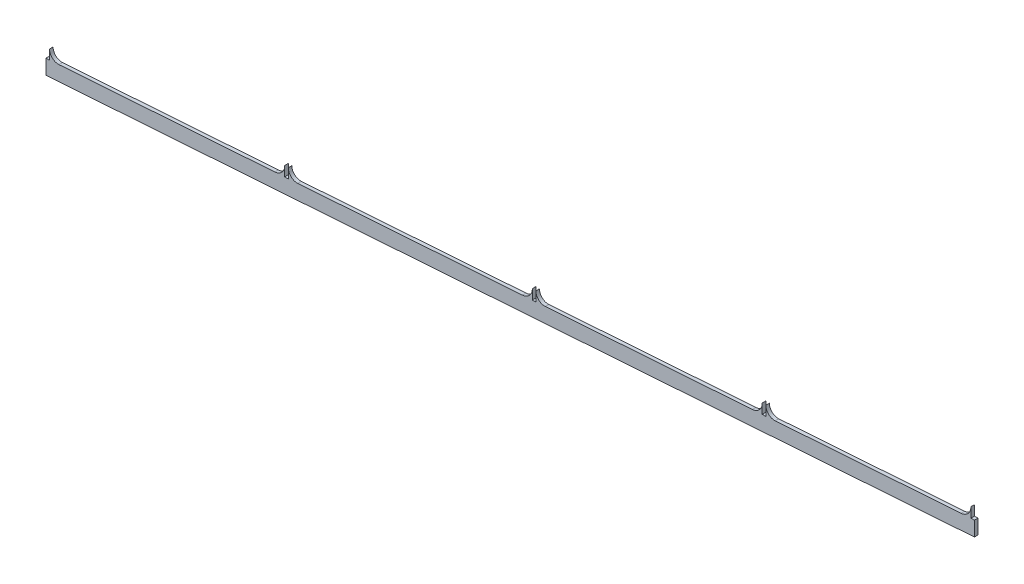
ISO-10303-21;
HEADER;
FILE_DESCRIPTION(('STEP AP214'),'2;1');
FILE_NAME('part.step','',(''),(''),'','','');
FILE_SCHEMA(('AUTOMOTIVE_DESIGN { 1 0 10303 214 1 1 1 1 }'));
ENDSEC;
DATA;
#1=APPLICATION_CONTEXT('core data for automotive mechanical design processes');
#2=APPLICATION_PROTOCOL_DEFINITION('international standard','automotive_design',2000,#1);
#3=PRODUCT_CONTEXT('',#1,'mechanical');
#4=PRODUCT('Part','Part','',(#3));
#5=PRODUCT_RELATED_PRODUCT_CATEGORY('part','',(#4));
#6=PRODUCT_DEFINITION_FORMATION('','',#4);
#7=PRODUCT_DEFINITION_CONTEXT('part definition',#1,'design');
#8=PRODUCT_DEFINITION('design','',#6,#7);
#9=PRODUCT_DEFINITION_SHAPE('','',#8);
#10=(LENGTH_UNIT() NAMED_UNIT(*) SI_UNIT(.MILLI.,.METRE.));
#11=(NAMED_UNIT(*) PLANE_ANGLE_UNIT() SI_UNIT($,.RADIAN.));
#12=(NAMED_UNIT(*) SI_UNIT($,.STERADIAN.) SOLID_ANGLE_UNIT());
#13=UNCERTAINTY_MEASURE_WITH_UNIT(LENGTH_MEASURE(1.E-05),#10,'distance_accuracy_value','');
#14=(GEOMETRIC_REPRESENTATION_CONTEXT(3) GLOBAL_UNCERTAINTY_ASSIGNED_CONTEXT((#13)) GLOBAL_UNIT_ASSIGNED_CONTEXT((#10,
#11,#12)) REPRESENTATION_CONTEXT('',''));
#15=CARTESIAN_POINT('',(0.,0.,0.));
#16=DIRECTION('',(0.,0.,1.));
#17=DIRECTION('',(1.,0.,0.));
#18=AXIS2_PLACEMENT_3D('',#15,#16,#17);
#19=CARTESIAN_POINT('',(132.593665372051,28.8945427780248,2.));
#20=DIRECTION('',(0.,0.,-1.));
#21=DIRECTION('',(-1.,0.,0.));
#22=AXIS2_PLACEMENT_3D('',#19,#20,#21);
#23=CYLINDRICAL_SURFACE('',#22,6.);
#24=CARTESIAN_POINT('',(132.593665372051,28.8945427780248,0.));
#25=DIRECTION('',(0.,0.,1.));
#26=DIRECTION('',(1.,0.,0.));
#27=AXIS2_PLACEMENT_3D('',#24,#25,#26);
#28=CIRCLE('',#27,6.);
#29=CARTESIAN_POINT('',(133.008509302483,22.9089012490504,0.));
#30=VERTEX_POINT('',#29);
#31=CARTESIAN_POINT('',(138.593665372051,28.894542778025,0.));
#32=VERTEX_POINT('',#31);
#33=EDGE_CURVE('E248',#30,#32,#28,.T.);
#34=ORIENTED_EDGE('',*,*,#33,.F.);
#35=DIRECTION('',(0.,0.,-1.));
#36=VECTOR('',#35,1.);
#37=CARTESIAN_POINT('',(133.008509302483,22.9089012490504,2.));
#38=LINE('',#37,#36);
#39=CARTESIAN_POINT('',(133.008509302483,22.9089012490504,2.));
#40=VERTEX_POINT('',#39);
#41=EDGE_CURVE('E11',#40,#30,#38,.T.);
#42=ORIENTED_EDGE('',*,*,#41,.F.);
#43=CARTESIAN_POINT('',(132.593665372051,28.8945427780248,2.));
#44=DIRECTION('',(0.,0.,1.));
#45=DIRECTION('',(1.,0.,0.));
#46=AXIS2_PLACEMENT_3D('',#43,#44,#45);
#47=CIRCLE('',#46,6.);
#48=CARTESIAN_POINT('',(138.593665372051,28.894542778025,2.));
#49=VERTEX_POINT('',#48);
#50=EDGE_CURVE('E317',#40,#49,#47,.T.);
#51=ORIENTED_EDGE('',*,*,#50,.T.);
#52=DIRECTION('',(0.,0.,-1.));
#53=VECTOR('',#52,1.);
#54=CARTESIAN_POINT('',(138.593665372051,28.894542778025,2.));
#55=LINE('',#54,#53);
#56=EDGE_CURVE('E147',#49,#32,#55,.T.);
#57=ORIENTED_EDGE('',*,*,#56,.T.);
#58=EDGE_LOOP('',(#34,#42,#51,#57));
#59=FACE_BOUND('',#58,.T.);
#60=ADVANCED_FACE('F36',(#59),#23,.F.);
#61=CARTESIAN_POINT('',(-0.944308062523726,13.625098839723,2.));
#62=DIRECTION('',(0.0691406550719055,-0.99760692149575,0.));
#63=DIRECTION('',(0.99760692149575,0.0691406550719055,0.));
#64=AXIS2_PLACEMENT_3D('',#61,#62,#63);
#65=PLANE('',#64);
#66=DIRECTION('',(-0.99760692149575,-0.0691406550719055,0.));
#67=VECTOR('',#66,1.);
#68=CARTESIAN_POINT('',(-0.944308062523726,13.625098839723,0.));
#69=LINE('',#68,#67);
#70=CARTESIAN_POINT('',(10.9393686474104,14.4487150102641,0.));
#71=VERTEX_POINT('',#70);
#72=EDGE_CURVE('E251',#30,#71,#69,.T.);
#73=ORIENTED_EDGE('',*,*,#72,.T.);
#74=DIRECTION('',(0.,0.,-1.));
#75=VECTOR('',#74,1.);
#76=CARTESIAN_POINT('',(10.9393686474104,14.4487150102641,2.));
#77=LINE('',#76,#75);
#78=CARTESIAN_POINT('',(10.9393686474104,14.4487150102641,2.));
#79=VERTEX_POINT('',#78);
#80=EDGE_CURVE('E44',#79,#71,#77,.T.);
#81=ORIENTED_EDGE('',*,*,#80,.F.);
#82=DIRECTION('',(-0.99760692149575,-0.0691406550719055,0.));
#83=VECTOR('',#82,1.);
#84=CARTESIAN_POINT('',(-0.944308062523726,13.625098839723,2.));
#85=LINE('',#84,#83);
#86=EDGE_CURVE('E454',#40,#79,#85,.T.);
#87=ORIENTED_EDGE('',*,*,#86,.F.);
#88=ORIENTED_EDGE('',*,*,#41,.T.);
#89=EDGE_LOOP('',(#73,#81,#87,#88));
#90=FACE_BOUND('',#89,.T.);
#91=ADVANCED_FACE('F383',(#90),#65,.F.);
#92=CARTESIAN_POINT('',(10.593665372051,19.4367496177429,2.));
#93=DIRECTION('',(0.,0.,-1.));
#94=DIRECTION('',(-1.,0.,0.));
#95=AXIS2_PLACEMENT_3D('',#92,#93,#94);
#96=CYLINDRICAL_SURFACE('',#95,5.);
#97=CARTESIAN_POINT('',(10.593665372051,19.4367496177429,0.));
#98=DIRECTION('',(0.,0.,1.));
#99=DIRECTION('',(1.,0.,0.));
#100=AXIS2_PLACEMENT_3D('',#97,#98,#99);
#101=CIRCLE('',#100,5.);
#102=CARTESIAN_POINT('',(5.59366537205096,19.4367496177429,0.));
#103=VERTEX_POINT('',#102);
#104=EDGE_CURVE('E254',#103,#71,#101,.T.);
#105=ORIENTED_EDGE('',*,*,#104,.F.);
#106=DIRECTION('',(0.,0.,-1.));
#107=VECTOR('',#106,1.);
#108=CARTESIAN_POINT('',(5.59366537205096,19.4367496177429,2.));
#109=LINE('',#108,#107);
#110=CARTESIAN_POINT('',(5.59366537205096,19.4367496177429,2.));
#111=VERTEX_POINT('',#110);
#112=EDGE_CURVE('E373',#111,#103,#109,.T.);
#113=ORIENTED_EDGE('',*,*,#112,.F.);
#114=CARTESIAN_POINT('',(10.593665372051,19.4367496177429,2.));
#115=DIRECTION('',(0.,0.,1.));
#116=DIRECTION('',(1.,0.,0.));
#117=AXIS2_PLACEMENT_3D('',#114,#115,#116);
#118=CIRCLE('',#117,5.);
#119=EDGE_CURVE('E380',#111,#79,#118,.T.);
#120=ORIENTED_EDGE('',*,*,#119,.T.);
#121=ORIENTED_EDGE('',*,*,#80,.T.);
#122=EDGE_LOOP('',(#105,#113,#120,#121));
#123=FACE_BOUND('',#122,.T.);
#124=ADVANCED_FACE('F378',(#123),#96,.F.);
#125=CARTESIAN_POINT('',(5.59366537205096,0.,2.));
#126=DIRECTION('',(1.,0.,0.));
#127=DIRECTION('',(0.,0.,-1.));
#128=AXIS2_PLACEMENT_3D('',#125,#126,#127);
#129=PLANE('',#128);
#130=DIRECTION('',(0.,-1.,0.));
#131=VECTOR('',#130,1.);
#132=CARTESIAN_POINT('',(5.59366537205096,0.,0.));
#133=LINE('',#132,#131);
#134=CARTESIAN_POINT('',(5.59366537205096,13.9396099454548,0.));
#135=VERTEX_POINT('',#134);
#136=EDGE_CURVE('E257',#103,#135,#133,.T.);
#137=ORIENTED_EDGE('',*,*,#136,.T.);
#138=DIRECTION('',(0.,0.,-1.));
#139=VECTOR('',#138,1.);
#140=CARTESIAN_POINT('',(5.59366537205096,13.9396099454548,2.));
#141=LINE('',#140,#139);
#142=CARTESIAN_POINT('',(5.59366537205096,13.9396099454548,2.));
#143=VERTEX_POINT('',#142);
#144=EDGE_CURVE('E370',#143,#135,#141,.T.);
#145=ORIENTED_EDGE('',*,*,#144,.F.);
#146=DIRECTION('',(0.,-1.,0.));
#147=VECTOR('',#146,1.);
#148=CARTESIAN_POINT('',(5.59366537205096,0.,2.));
#149=LINE('',#148,#147);
#150=EDGE_CURVE('E400',#111,#143,#149,.T.);
#151=ORIENTED_EDGE('',*,*,#150,.F.);
#152=ORIENTED_EDGE('',*,*,#112,.T.);
#153=EDGE_LOOP('',(#137,#145,#151,#152));
#154=FACE_BOUND('',#153,.T.);
#155=ADVANCED_FACE('F391',(#154),#129,.F.);
#156=CARTESIAN_POINT('',(0.,13.9396099454548,2.));
#157=DIRECTION('',(0.,-1.,0.));
#158=DIRECTION('',(0.,0.,-1.));
#159=AXIS2_PLACEMENT_3D('',#156,#157,#158);
#160=PLANE('',#159);
#161=DIRECTION('',(-1.,0.,0.));
#162=VECTOR('',#161,1.);
#163=CARTESIAN_POINT('',(0.,13.9396099454548,0.));
#164=LINE('',#163,#162);
#165=CARTESIAN_POINT('',(3.59366537205096,13.9396099454548,0.));
#166=VERTEX_POINT('',#165);
#167=EDGE_CURVE('E259',#135,#166,#164,.T.);
#168=ORIENTED_EDGE('',*,*,#167,.T.);
#169=DIRECTION('',(0.,0.,-1.));
#170=VECTOR('',#169,1.);
#171=CARTESIAN_POINT('',(3.59366537205096,13.9396099454548,2.));
#172=LINE('',#171,#170);
#173=CARTESIAN_POINT('',(3.59366537205096,13.9396099454548,2.));
#174=VERTEX_POINT('',#173);
#175=EDGE_CURVE('E367',#174,#166,#172,.T.);
#176=ORIENTED_EDGE('',*,*,#175,.F.);
#177=DIRECTION('',(-1.,0.,0.));
#178=VECTOR('',#177,1.);
#179=CARTESIAN_POINT('',(0.,13.9396099454548,2.));
#180=LINE('',#179,#178);
#181=EDGE_CURVE('E397',#143,#174,#180,.T.);
#182=ORIENTED_EDGE('',*,*,#181,.F.);
#183=ORIENTED_EDGE('',*,*,#144,.T.);
#184=EDGE_LOOP('',(#168,#176,#182,#183));
#185=FACE_BOUND('',#184,.T.);
#186=ADVANCED_FACE('F395',(#185),#160,.F.);
#187=CARTESIAN_POINT('',(3.59366537205096,0.,2.));
#188=DIRECTION('',(1.,0.,0.));
#189=DIRECTION('',(0.,0.,-1.));
#190=AXIS2_PLACEMENT_3D('',#187,#188,#189);
#191=PLANE('',#190);
#192=DIRECTION('',(0.,-1.,0.));
#193=VECTOR('',#192,1.);
#194=CARTESIAN_POINT('',(3.59366537205096,0.,0.));
#195=LINE('',#194,#193);
#196=CARTESIAN_POINT('',(3.59366537205096,5.53960994545469,0.));
#197=VERTEX_POINT('',#196);
#198=EDGE_CURVE('E261',#166,#197,#195,.T.);
#199=ORIENTED_EDGE('',*,*,#198,.T.);
#200=DIRECTION('',(0.,0.,-1.));
#201=VECTOR('',#200,1.);
#202=CARTESIAN_POINT('',(3.59366537205096,5.53960994545469,2.));
#203=LINE('',#202,#201);
#204=CARTESIAN_POINT('',(3.59366537205096,5.53960994545469,2.));
#205=VERTEX_POINT('',#204);
#206=EDGE_CURVE('E364',#205,#197,#203,.T.);
#207=ORIENTED_EDGE('',*,*,#206,.F.);
#208=DIRECTION('',(0.,-1.,0.));
#209=VECTOR('',#208,1.);
#210=CARTESIAN_POINT('',(3.59366537205096,0.,2.));
#211=LINE('',#210,#209);
#212=EDGE_CURVE('E399',#174,#205,#211,.T.);
#213=ORIENTED_EDGE('',*,*,#212,.F.);
#214=ORIENTED_EDGE('',*,*,#175,.T.);
#215=EDGE_LOOP('',(#199,#207,#213,#214));
#216=FACE_BOUND('',#215,.T.);
#217=ADVANCED_FACE('F470',(#216),#191,.F.);
#218=CARTESIAN_POINT('',(-0.364916415649253,5.2652544532665,2.));
#219=DIRECTION('',(-0.0691406550719058,0.99760692149575,0.));
#220=DIRECTION('',(-0.99760692149575,-0.0691406550719058,0.));
#221=AXIS2_PLACEMENT_3D('',#218,#219,#220);
#222=PLANE('',#221);
#223=DIRECTION('',(0.99760692149575,0.0691406550719058,0.));
#224=VECTOR('',#223,1.);
#225=CARTESIAN_POINT('',(-0.364916415649253,5.2652544532665,0.));
#226=LINE('',#225,#224);
#227=CARTESIAN_POINT('',(528.59366537205,41.9255282170784,0.));
#228=VERTEX_POINT('',#227);
#229=EDGE_CURVE('E263',#197,#228,#226,.T.);
#230=ORIENTED_EDGE('',*,*,#229,.T.);
#231=DIRECTION('',(0.,0.,-1.));
#232=VECTOR('',#231,1.);
#233=CARTESIAN_POINT('',(528.59366537205,41.9255282170784,2.));
#234=LINE('',#233,#232);
#235=CARTESIAN_POINT('',(528.59366537205,41.9255282170784,2.));
#236=VERTEX_POINT('',#235);
#237=EDGE_CURVE('E361',#236,#228,#234,.T.);
#238=ORIENTED_EDGE('',*,*,#237,.F.);
#239=DIRECTION('',(0.99760692149575,0.0691406550719058,0.));
#240=VECTOR('',#239,1.);
#241=CARTESIAN_POINT('',(-0.364916415649253,5.2652544532665,2.));
#242=LINE('',#241,#240);
#243=EDGE_CURVE('E402',#205,#236,#242,.T.);
#244=ORIENTED_EDGE('',*,*,#243,.F.);
#245=ORIENTED_EDGE('',*,*,#206,.T.);
#246=EDGE_LOOP('',(#230,#238,#244,#245));
#247=FACE_BOUND('',#246,.T.);
#248=ADVANCED_FACE('F473',(#247),#222,.F.);
#249=CARTESIAN_POINT('',(528.59366537205,0.,2.));
#250=DIRECTION('',(-1.,0.,0.));
#251=DIRECTION('',(0.,0.,1.));
#252=AXIS2_PLACEMENT_3D('',#249,#250,#251);
#253=PLANE('',#252);
#254=DIRECTION('',(0.,1.,0.));
#255=VECTOR('',#254,1.);
#256=CARTESIAN_POINT('',(528.59366537205,0.,0.));
#257=LINE('',#256,#255);
#258=CARTESIAN_POINT('',(528.59366537205,50.1869151950914,0.));
#259=VERTEX_POINT('',#258);
#260=EDGE_CURVE('E265',#228,#259,#257,.T.);
#261=ORIENTED_EDGE('',*,*,#260,.T.);
#262=DIRECTION('',(0.,0.,-1.));
#263=VECTOR('',#262,1.);
#264=CARTESIAN_POINT('',(528.59366537205,50.1869151950914,2.));
#265=LINE('',#264,#263);
#266=CARTESIAN_POINT('',(528.59366537205,50.1869151950914,2.));
#267=VERTEX_POINT('',#266);
#268=EDGE_CURVE('E358',#267,#259,#265,.T.);
#269=ORIENTED_EDGE('',*,*,#268,.F.);
#270=DIRECTION('',(0.,1.,0.));
#271=VECTOR('',#270,1.);
#272=CARTESIAN_POINT('',(528.59366537205,0.,2.));
#273=LINE('',#272,#271);
#274=EDGE_CURVE('E408',#236,#267,#273,.T.);
#275=ORIENTED_EDGE('',*,*,#274,.F.);
#276=ORIENTED_EDGE('',*,*,#237,.T.);
#277=EDGE_LOOP('',(#261,#269,#275,#276));
#278=FACE_BOUND('',#277,.T.);
#279=ADVANCED_FACE('F477',(#278),#253,.F.);
#280=CARTESIAN_POINT('',(0.,50.1869151950914,2.));
#281=DIRECTION('',(0.,-1.,0.));
#282=DIRECTION('',(0.,0.,-1.));
#283=AXIS2_PLACEMENT_3D('',#280,#281,#282);
#284=PLANE('',#283);
#285=DIRECTION('',(-1.,0.,0.));
#286=VECTOR('',#285,1.);
#287=CARTESIAN_POINT('',(0.,50.1869151950914,0.));
#288=LINE('',#287,#286);
#289=CARTESIAN_POINT('',(526.59366537205,50.1869151950914,0.));
#290=VERTEX_POINT('',#289);
#291=EDGE_CURVE('E267',#259,#290,#288,.T.);
#292=ORIENTED_EDGE('',*,*,#291,.T.);
#293=DIRECTION('',(0.,0.,-1.));
#294=VECTOR('',#293,1.);
#295=CARTESIAN_POINT('',(526.59366537205,50.1869151950914,2.));
#296=LINE('',#295,#294);
#297=CARTESIAN_POINT('',(526.59366537205,50.1869151950914,2.));
#298=VERTEX_POINT('',#297);
#299=EDGE_CURVE('E355',#298,#290,#296,.T.);
#300=ORIENTED_EDGE('',*,*,#299,.F.);
#301=DIRECTION('',(-1.,0.,0.));
#302=VECTOR('',#301,1.);
#303=CARTESIAN_POINT('',(0.,50.1869151950914,2.));
#304=LINE('',#303,#302);
#305=EDGE_CURVE('E410',#267,#298,#304,.T.);
#306=ORIENTED_EDGE('',*,*,#305,.F.);
#307=ORIENTED_EDGE('',*,*,#268,.T.);
#308=EDGE_LOOP('',(#292,#300,#306,#307));
#309=FACE_BOUND('',#308,.T.);
#310=ADVANCED_FACE('F481',(#309),#284,.F.);
#311=CARTESIAN_POINT('',(526.59366537205,0.,2.));
#312=DIRECTION('',(-1.,0.,0.));
#313=DIRECTION('',(0.,0.,1.));
#314=AXIS2_PLACEMENT_3D('',#311,#312,#313);
#315=PLANE('',#314);
#316=DIRECTION('',(0.,1.,0.));
#317=VECTOR('',#316,1.);
#318=CARTESIAN_POINT('',(526.59366537205,0.,0.));
#319=LINE('',#318,#317);
#320=CARTESIAN_POINT('',(526.59366537205,55.7854690435297,0.));
#321=VERTEX_POINT('',#320);
#322=EDGE_CURVE('E269',#290,#321,#319,.T.);
#323=ORIENTED_EDGE('',*,*,#322,.T.);
#324=DIRECTION('',(0.,0.,-1.));
#325=VECTOR('',#324,1.);
#326=CARTESIAN_POINT('',(526.59366537205,55.7854690435297,2.));
#327=LINE('',#326,#325);
#328=CARTESIAN_POINT('',(526.59366537205,55.7854690435297,2.));
#329=VERTEX_POINT('',#328);
#330=EDGE_CURVE('E353',#329,#321,#327,.T.);
#331=ORIENTED_EDGE('',*,*,#330,.F.);
#332=DIRECTION('',(0.,1.,0.));
#333=VECTOR('',#332,1.);
#334=CARTESIAN_POINT('',(526.59366537205,0.,2.));
#335=LINE('',#334,#333);
#336=EDGE_CURVE('E412',#298,#329,#335,.T.);
#337=ORIENTED_EDGE('',*,*,#336,.F.);
#338=ORIENTED_EDGE('',*,*,#299,.T.);
#339=EDGE_LOOP('',(#323,#331,#337,#338));
#340=FACE_BOUND('',#339,.T.);
#341=ADVANCED_FACE('F485',(#340),#315,.F.);
#342=CARTESIAN_POINT('',(520.59366537205,55.7854690435296,2.));
#343=DIRECTION('',(0.,0.,-1.));
#344=DIRECTION('',(-1.,0.,0.));
#345=AXIS2_PLACEMENT_3D('',#342,#343,#344);
#346=CYLINDRICAL_SURFACE('',#345,6.);
#347=CARTESIAN_POINT('',(520.59366537205,55.7854690435296,0.));
#348=DIRECTION('',(0.,0.,1.));
#349=DIRECTION('',(1.,0.,0.));
#350=AXIS2_PLACEMENT_3D('',#347,#348,#349);
#351=CIRCLE('',#350,6.);
#352=CARTESIAN_POINT('',(521.008509302482,49.7998275145551,0.));
#353=VERTEX_POINT('',#352);
#354=EDGE_CURVE('E272',#353,#321,#351,.T.);
#355=ORIENTED_EDGE('',*,*,#354,.F.);
#356=DIRECTION('',(0.,0.,-1.));
#357=VECTOR('',#356,1.);
#358=CARTESIAN_POINT('',(521.008509302482,49.7998275145551,2.));
#359=LINE('',#358,#357);
#360=CARTESIAN_POINT('',(521.008509302482,49.7998275145551,2.));
#361=VERTEX_POINT('',#360);
#362=EDGE_CURVE('E351',#361,#353,#359,.T.);
#363=ORIENTED_EDGE('',*,*,#362,.F.);
#364=CARTESIAN_POINT('',(520.59366537205,55.7854690435296,2.));
#365=DIRECTION('',(0.,0.,1.));
#366=DIRECTION('',(1.,0.,0.));
#367=AXIS2_PLACEMENT_3D('',#364,#365,#366);
#368=CIRCLE('',#367,6.);
#369=EDGE_CURVE('E414',#361,#329,#368,.T.);
#370=ORIENTED_EDGE('',*,*,#369,.T.);
#371=ORIENTED_EDGE('',*,*,#330,.T.);
#372=EDGE_LOOP('',(#355,#363,#370,#371));
#373=FACE_BOUND('',#372,.T.);
#374=ADVANCED_FACE('F489',(#373),#346,.F.);
#375=CARTESIAN_POINT('',(-0.944308062523782,13.6250988397243,2.));
#376=DIRECTION('',(0.0691406550719033,-0.99760692149575,0.));
#377=DIRECTION('',(0.99760692149575,0.0691406550719033,0.));
#378=AXIS2_PLACEMENT_3D('',#375,#376,#377);
#379=PLANE('',#378);
#380=DIRECTION('',(-0.99760692149575,-0.0691406550719033,0.));
#381=VECTOR('',#380,1.);
#382=CARTESIAN_POINT('',(-0.944308062523782,13.6250988397243,0.));
#383=LINE('',#382,#381);
#384=CARTESIAN_POINT('',(415.93936864741,42.5178519626597,0.));
#385=VERTEX_POINT('',#384);
#386=EDGE_CURVE('E275',#353,#385,#383,.T.);
#387=ORIENTED_EDGE('',*,*,#386,.T.);
#388=DIRECTION('',(0.,0.,-1.));
#389=VECTOR('',#388,1.);
#390=CARTESIAN_POINT('',(415.93936864741,42.5178519626597,2.));
#391=LINE('',#390,#389);
#392=CARTESIAN_POINT('',(415.93936864741,42.5178519626597,2.));
#393=VERTEX_POINT('',#392);
#394=EDGE_CURVE('E349',#393,#385,#391,.T.);
#395=ORIENTED_EDGE('',*,*,#394,.F.);
#396=DIRECTION('',(-0.99760692149575,-0.0691406550719033,0.));
#397=VECTOR('',#396,1.);
#398=CARTESIAN_POINT('',(-0.944308062523782,13.6250988397243,2.));
#399=LINE('',#398,#397);
#400=EDGE_CURVE('E417',#361,#393,#399,.T.);
#401=ORIENTED_EDGE('',*,*,#400,.F.);
#402=ORIENTED_EDGE('',*,*,#362,.T.);
#403=EDGE_LOOP('',(#387,#395,#401,#402));
#404=FACE_BOUND('',#403,.T.);
#405=ADVANCED_FACE('F493',(#404),#379,.F.);
#406=CARTESIAN_POINT('',(415.59366537205,47.5058865701385,2.));
#407=DIRECTION('',(0.,0.,-1.));
#408=DIRECTION('',(-1.,0.,0.));
#409=AXIS2_PLACEMENT_3D('',#406,#407,#408);
#410=CYLINDRICAL_SURFACE('',#409,5.);
#411=CARTESIAN_POINT('',(415.59366537205,47.5058865701385,0.));
#412=DIRECTION('',(0.,0.,1.));
#413=DIRECTION('',(1.,0.,0.));
#414=AXIS2_PLACEMENT_3D('',#411,#412,#413);
#415=CIRCLE('',#414,5.);
#416=CARTESIAN_POINT('',(410.59366537205,47.5058865701385,0.));
#417=VERTEX_POINT('',#416);
#418=EDGE_CURVE('E278',#417,#385,#415,.T.);
#419=ORIENTED_EDGE('',*,*,#418,.F.);
#420=DIRECTION('',(0.,0.,-1.));
#421=VECTOR('',#420,1.);
#422=CARTESIAN_POINT('',(410.59366537205,47.5058865701385,2.));
#423=LINE('',#422,#421);
#424=CARTESIAN_POINT('',(410.59366537205,47.5058865701385,2.));
#425=VERTEX_POINT('',#424);
#426=EDGE_CURVE('E347',#425,#417,#423,.T.);
#427=ORIENTED_EDGE('',*,*,#426,.F.);
#428=CARTESIAN_POINT('',(415.59366537205,47.5058865701385,2.));
#429=DIRECTION('',(0.,0.,1.));
#430=DIRECTION('',(1.,0.,0.));
#431=AXIS2_PLACEMENT_3D('',#428,#429,#430);
#432=CIRCLE('',#431,5.);
#433=EDGE_CURVE('E419',#425,#393,#432,.T.);
#434=ORIENTED_EDGE('',*,*,#433,.T.);
#435=ORIENTED_EDGE('',*,*,#394,.T.);
#436=EDGE_LOOP('',(#419,#427,#434,#435));
#437=FACE_BOUND('',#436,.T.);
#438=ADVANCED_FACE('F497',(#437),#410,.F.);
#439=CARTESIAN_POINT('',(410.59366537205,0.,2.));
#440=DIRECTION('',(1.,0.,0.));
#441=DIRECTION('',(0.,0.,-1.));
#442=AXIS2_PLACEMENT_3D('',#439,#440,#441);
#443=PLANE('',#442);
#444=DIRECTION('',(0.,-1.,0.));
#445=VECTOR('',#444,1.);
#446=CARTESIAN_POINT('',(410.59366537205,0.,0.));
#447=LINE('',#446,#445);
#448=CARTESIAN_POINT('',(410.59366537205,42.0087468978504,0.));
#449=VERTEX_POINT('',#448);
#450=EDGE_CURVE('E281',#417,#449,#447,.T.);
#451=ORIENTED_EDGE('',*,*,#450,.T.);
#452=DIRECTION('',(0.,0.,-1.));
#453=VECTOR('',#452,1.);
#454=CARTESIAN_POINT('',(410.59366537205,42.0087468978504,2.));
#455=LINE('',#454,#453);
#456=CARTESIAN_POINT('',(410.59366537205,42.0087468978504,2.));
#457=VERTEX_POINT('',#456);
#458=EDGE_CURVE('E344',#457,#449,#455,.T.);
#459=ORIENTED_EDGE('',*,*,#458,.F.);
#460=DIRECTION('',(0.,-1.,0.));
#461=VECTOR('',#460,1.);
#462=CARTESIAN_POINT('',(410.59366537205,0.,2.));
#463=LINE('',#462,#461);
#464=EDGE_CURVE('E422',#425,#457,#463,.T.);
#465=ORIENTED_EDGE('',*,*,#464,.F.);
#466=ORIENTED_EDGE('',*,*,#426,.T.);
#467=EDGE_LOOP('',(#451,#459,#465,#466));
#468=FACE_BOUND('',#467,.T.);
#469=ADVANCED_FACE('F501',(#468),#443,.F.);
#470=CARTESIAN_POINT('',(0.,42.0087468978504,2.));
#471=DIRECTION('',(0.,-1.,0.));
#472=DIRECTION('',(0.,0.,-1.));
#473=AXIS2_PLACEMENT_3D('',#470,#471,#472);
#474=PLANE('',#473);
#475=DIRECTION('',(-1.,0.,0.));
#476=VECTOR('',#475,1.);
#477=CARTESIAN_POINT('',(0.,42.0087468978504,0.));
#478=LINE('',#477,#476);
#479=CARTESIAN_POINT('',(408.59366537205,42.0087468978504,0.));
#480=VERTEX_POINT('',#479);
#481=EDGE_CURVE('E283',#449,#480,#478,.T.);
#482=ORIENTED_EDGE('',*,*,#481,.T.);
#483=DIRECTION('',(0.,0.,-1.));
#484=VECTOR('',#483,1.);
#485=CARTESIAN_POINT('',(408.59366537205,42.0087468978504,2.));
#486=LINE('',#485,#484);
#487=CARTESIAN_POINT('',(408.59366537205,42.0087468978504,2.));
#488=VERTEX_POINT('',#487);
#489=EDGE_CURVE('E341',#488,#480,#486,.T.);
#490=ORIENTED_EDGE('',*,*,#489,.F.);
#491=DIRECTION('',(-1.,0.,0.));
#492=VECTOR('',#491,1.);
#493=CARTESIAN_POINT('',(0.,42.0087468978504,2.));
#494=LINE('',#493,#492);
#495=EDGE_CURVE('E424',#457,#488,#494,.T.);
#496=ORIENTED_EDGE('',*,*,#495,.F.);
#497=ORIENTED_EDGE('',*,*,#458,.T.);
#498=EDGE_LOOP('',(#482,#490,#496,#497));
#499=FACE_BOUND('',#498,.T.);
#500=ADVANCED_FACE('F505',(#499),#474,.F.);
#501=CARTESIAN_POINT('',(408.59366537205,0.,2.));
#502=DIRECTION('',(-1.,0.,0.));
#503=DIRECTION('',(0.,0.,1.));
#504=AXIS2_PLACEMENT_3D('',#501,#502,#503);
#505=PLANE('',#504);
#506=DIRECTION('',(0.,1.,0.));
#507=VECTOR('',#506,1.);
#508=CARTESIAN_POINT('',(408.59366537205,0.,0.));
#509=LINE('',#508,#507);
#510=CARTESIAN_POINT('',(408.59366537205,47.6073007462915,0.));
#511=VERTEX_POINT('',#510);
#512=EDGE_CURVE('E285',#480,#511,#509,.T.);
#513=ORIENTED_EDGE('',*,*,#512,.T.);
#514=DIRECTION('',(0.,0.,-1.));
#515=VECTOR('',#514,1.);
#516=CARTESIAN_POINT('',(408.59366537205,47.6073007462915,2.));
#517=LINE('',#516,#515);
#518=CARTESIAN_POINT('',(408.59366537205,47.6073007462915,2.));
#519=VERTEX_POINT('',#518);
#520=EDGE_CURVE('E339',#519,#511,#517,.T.);
#521=ORIENTED_EDGE('',*,*,#520,.F.);
#522=DIRECTION('',(0.,1.,0.));
#523=VECTOR('',#522,1.);
#524=CARTESIAN_POINT('',(408.59366537205,0.,2.));
#525=LINE('',#524,#523);
#526=EDGE_CURVE('E426',#488,#519,#525,.T.);
#527=ORIENTED_EDGE('',*,*,#526,.F.);
#528=ORIENTED_EDGE('',*,*,#489,.T.);
#529=EDGE_LOOP('',(#513,#521,#527,#528));
#530=FACE_BOUND('',#529,.T.);
#531=ADVANCED_FACE('F509',(#530),#505,.F.);
#532=CARTESIAN_POINT('',(402.59366537205,47.6073007462881,2.));
#533=DIRECTION('',(0.,0.,-1.));
#534=DIRECTION('',(-1.,0.,0.));
#535=AXIS2_PLACEMENT_3D('',#532,#533,#534);
#536=CYLINDRICAL_SURFACE('',#535,6.00000000000001);
#537=CARTESIAN_POINT('',(402.59366537205,47.6073007462881,0.));
#538=DIRECTION('',(0.,0.,1.));
#539=DIRECTION('',(1.,0.,0.));
#540=AXIS2_PLACEMENT_3D('',#537,#538,#539);
#541=CIRCLE('',#540,6.00000000000001);
#542=CARTESIAN_POINT('',(403.008509302482,41.6216592173137,0.));
#543=VERTEX_POINT('',#542);
#544=EDGE_CURVE('E288',#543,#511,#541,.T.);
#545=ORIENTED_EDGE('',*,*,#544,.F.);
#546=DIRECTION('',(0.,0.,-1.));
#547=VECTOR('',#546,1.);
#548=CARTESIAN_POINT('',(403.008509302482,41.6216592173137,2.));
#549=LINE('',#548,#547);
#550=CARTESIAN_POINT('',(403.008509302482,41.6216592173137,2.));
#551=VERTEX_POINT('',#550);
#552=EDGE_CURVE('E337',#551,#543,#549,.T.);
#553=ORIENTED_EDGE('',*,*,#552,.F.);
#554=CARTESIAN_POINT('',(402.59366537205,47.6073007462881,2.));
#555=DIRECTION('',(0.,0.,1.));
#556=DIRECTION('',(1.,0.,0.));
#557=AXIS2_PLACEMENT_3D('',#554,#555,#556);
#558=CIRCLE('',#557,6.00000000000001);
#559=EDGE_CURVE('E428',#551,#519,#558,.T.);
#560=ORIENTED_EDGE('',*,*,#559,.T.);
#561=ORIENTED_EDGE('',*,*,#520,.T.);
#562=EDGE_LOOP('',(#545,#553,#560,#561));
#563=FACE_BOUND('',#562,.T.);
#564=ADVANCED_FACE('F513',(#563),#536,.F.);
#565=CARTESIAN_POINT('',(-0.944308062523752,13.625098839724,2.));
#566=DIRECTION('',(0.0691406550719027,-0.99760692149575,0.));
#567=DIRECTION('',(0.99760692149575,0.0691406550719027,0.));
#568=AXIS2_PLACEMENT_3D('',#565,#566,#567);
#569=PLANE('',#568);
#570=DIRECTION('',(-0.99760692149575,-0.0691406550719027,0.));
#571=VECTOR('',#570,1.);
#572=CARTESIAN_POINT('',(-0.944308062523752,13.625098839724,0.));
#573=LINE('',#572,#571);
#574=CARTESIAN_POINT('',(285.93936864741,33.5080055334956,0.));
#575=VERTEX_POINT('',#574);
#576=EDGE_CURVE('E291',#543,#575,#573,.T.);
#577=ORIENTED_EDGE('',*,*,#576,.T.);
#578=DIRECTION('',(0.,0.,-1.));
#579=VECTOR('',#578,1.);
#580=CARTESIAN_POINT('',(285.93936864741,33.5080055334956,2.));
#581=LINE('',#580,#579);
#582=CARTESIAN_POINT('',(285.93936864741,33.5080055334956,2.));
#583=VERTEX_POINT('',#582);
#584=EDGE_CURVE('E335',#583,#575,#581,.T.);
#585=ORIENTED_EDGE('',*,*,#584,.F.);
#586=DIRECTION('',(-0.99760692149575,-0.0691406550719027,0.));
#587=VECTOR('',#586,1.);
#588=CARTESIAN_POINT('',(-0.944308062523752,13.625098839724,2.));
#589=LINE('',#588,#587);
#590=EDGE_CURVE('E431',#551,#583,#589,.T.);
#591=ORIENTED_EDGE('',*,*,#590,.F.);
#592=ORIENTED_EDGE('',*,*,#552,.T.);
#593=EDGE_LOOP('',(#577,#585,#591,#592));
#594=FACE_BOUND('',#593,.T.);
#595=ADVANCED_FACE('F517',(#594),#569,.F.);
#596=CARTESIAN_POINT('',(285.593665372051,38.4960401409744,2.));
#597=DIRECTION('',(0.,0.,-1.));
#598=DIRECTION('',(-1.,0.,0.));
#599=AXIS2_PLACEMENT_3D('',#596,#597,#598);
#600=CYLINDRICAL_SURFACE('',#599,4.99999999999997);
#601=CARTESIAN_POINT('',(285.593665372051,38.4960401409744,0.));
#602=DIRECTION('',(0.,0.,1.));
#603=DIRECTION('',(1.,0.,0.));
#604=AXIS2_PLACEMENT_3D('',#601,#602,#603);
#605=CIRCLE('',#604,4.99999999999997);
#606=CARTESIAN_POINT('',(280.593665372051,38.4960401409744,0.));
#607=VERTEX_POINT('',#606);
#608=EDGE_CURVE('E294',#607,#575,#605,.T.);
#609=ORIENTED_EDGE('',*,*,#608,.F.);
#610=DIRECTION('',(0.,0.,-1.));
#611=VECTOR('',#610,1.);
#612=CARTESIAN_POINT('',(280.593665372051,38.4960401409744,2.));
#613=LINE('',#612,#611);
#614=CARTESIAN_POINT('',(280.593665372051,38.4960401409744,2.));
#615=VERTEX_POINT('',#614);
#616=EDGE_CURVE('E333',#615,#607,#613,.T.);
#617=ORIENTED_EDGE('',*,*,#616,.F.);
#618=CARTESIAN_POINT('',(285.593665372051,38.4960401409744,2.));
#619=DIRECTION('',(0.,0.,1.));
#620=DIRECTION('',(1.,0.,0.));
#621=AXIS2_PLACEMENT_3D('',#618,#619,#620);
#622=CIRCLE('',#621,4.99999999999997);
#623=EDGE_CURVE('E433',#615,#583,#622,.T.);
#624=ORIENTED_EDGE('',*,*,#623,.T.);
#625=ORIENTED_EDGE('',*,*,#584,.T.);
#626=EDGE_LOOP('',(#609,#617,#624,#625));
#627=FACE_BOUND('',#626,.T.);
#628=ADVANCED_FACE('F521',(#627),#600,.F.);
#629=CARTESIAN_POINT('',(280.593665372051,0.,2.));
#630=DIRECTION('',(1.,0.,0.));
#631=DIRECTION('',(0.,0.,-1.));
#632=AXIS2_PLACEMENT_3D('',#629,#630,#631);
#633=PLANE('',#632);
#634=DIRECTION('',(0.,-1.,0.));
#635=VECTOR('',#634,1.);
#636=CARTESIAN_POINT('',(280.593665372051,0.,0.));
#637=LINE('',#636,#635);
#638=CARTESIAN_POINT('',(280.593665372051,32.9989004686863,0.));
#639=VERTEX_POINT('',#638);
#640=EDGE_CURVE('E297',#607,#639,#637,.T.);
#641=ORIENTED_EDGE('',*,*,#640,.T.);
#642=DIRECTION('',(0.,0.,-1.));
#643=VECTOR('',#642,1.);
#644=CARTESIAN_POINT('',(280.593665372051,32.9989004686863,2.));
#645=LINE('',#644,#643);
#646=CARTESIAN_POINT('',(280.593665372051,32.9989004686863,2.));
#647=VERTEX_POINT('',#646);
#648=EDGE_CURVE('E330',#647,#639,#645,.T.);
#649=ORIENTED_EDGE('',*,*,#648,.F.);
#650=DIRECTION('',(0.,-1.,0.));
#651=VECTOR('',#650,1.);
#652=CARTESIAN_POINT('',(280.593665372051,0.,2.));
#653=LINE('',#652,#651);
#654=EDGE_CURVE('E436',#615,#647,#653,.T.);
#655=ORIENTED_EDGE('',*,*,#654,.F.);
#656=ORIENTED_EDGE('',*,*,#616,.T.);
#657=EDGE_LOOP('',(#641,#649,#655,#656));
#658=FACE_BOUND('',#657,.T.);
#659=ADVANCED_FACE('F525',(#658),#633,.F.);
#660=CARTESIAN_POINT('',(0.,32.9989004686863,2.));
#661=DIRECTION('',(0.,-1.,0.));
#662=DIRECTION('',(0.,0.,-1.));
#663=AXIS2_PLACEMENT_3D('',#660,#661,#662);
#664=PLANE('',#663);
#665=DIRECTION('',(-1.,0.,0.));
#666=VECTOR('',#665,1.);
#667=CARTESIAN_POINT('',(0.,32.9989004686863,0.));
#668=LINE('',#667,#666);
#669=CARTESIAN_POINT('',(278.593665372051,32.9989004686863,0.));
#670=VERTEX_POINT('',#669);
#671=EDGE_CURVE('E299',#639,#670,#668,.T.);
#672=ORIENTED_EDGE('',*,*,#671,.T.);
#673=DIRECTION('',(0.,0.,-1.));
#674=VECTOR('',#673,1.);
#675=CARTESIAN_POINT('',(278.593665372051,32.9989004686863,2.));
#676=LINE('',#675,#674);
#677=CARTESIAN_POINT('',(278.593665372051,32.9989004686863,2.));
#678=VERTEX_POINT('',#677);
#679=EDGE_CURVE('E327',#678,#670,#676,.T.);
#680=ORIENTED_EDGE('',*,*,#679,.F.);
#681=DIRECTION('',(-1.,0.,0.));
#682=VECTOR('',#681,1.);
#683=CARTESIAN_POINT('',(0.,32.9989004686863,2.));
#684=LINE('',#683,#682);
#685=EDGE_CURVE('E438',#647,#678,#684,.T.);
#686=ORIENTED_EDGE('',*,*,#685,.F.);
#687=ORIENTED_EDGE('',*,*,#648,.T.);
#688=EDGE_LOOP('',(#672,#680,#686,#687));
#689=FACE_BOUND('',#688,.T.);
#690=ADVANCED_FACE('F529',(#689),#664,.F.);
#691=CARTESIAN_POINT('',(278.593665372051,0.,2.));
#692=DIRECTION('',(-1.,0.,0.));
#693=DIRECTION('',(0.,0.,1.));
#694=AXIS2_PLACEMENT_3D('',#691,#692,#693);
#695=PLANE('',#694);
#696=DIRECTION('',(0.,1.,0.));
#697=VECTOR('',#696,1.);
#698=CARTESIAN_POINT('',(278.593665372051,0.,0.));
#699=LINE('',#698,#697);
#700=CARTESIAN_POINT('',(278.593665372051,38.5974543171246,0.));
#701=VERTEX_POINT('',#700);
#702=EDGE_CURVE('E301',#670,#701,#699,.T.);
#703=ORIENTED_EDGE('',*,*,#702,.T.);
#704=DIRECTION('',(0.,0.,-1.));
#705=VECTOR('',#704,1.);
#706=CARTESIAN_POINT('',(278.593665372051,38.5974543171246,2.));
#707=LINE('',#706,#705);
#708=CARTESIAN_POINT('',(278.593665372051,38.5974543171246,2.));
#709=VERTEX_POINT('',#708);
#710=EDGE_CURVE('E325',#709,#701,#707,.T.);
#711=ORIENTED_EDGE('',*,*,#710,.F.);
#712=DIRECTION('',(0.,1.,0.));
#713=VECTOR('',#712,1.);
#714=CARTESIAN_POINT('',(278.593665372051,0.,2.));
#715=LINE('',#714,#713);
#716=EDGE_CURVE('E440',#678,#709,#715,.T.);
#717=ORIENTED_EDGE('',*,*,#716,.F.);
#718=ORIENTED_EDGE('',*,*,#679,.T.);
#719=EDGE_LOOP('',(#703,#711,#717,#718));
#720=FACE_BOUND('',#719,.T.);
#721=ADVANCED_FACE('F533',(#720),#695,.F.);
#722=CARTESIAN_POINT('',(272.593665372051,38.5974543171245,2.));
#723=DIRECTION('',(0.,0.,-1.));
#724=DIRECTION('',(-1.,0.,0.));
#725=AXIS2_PLACEMENT_3D('',#722,#723,#724);
#726=CYLINDRICAL_SURFACE('',#725,6.);
#727=CARTESIAN_POINT('',(272.593665372051,38.5974543171245,0.));
#728=DIRECTION('',(0.,0.,1.));
#729=DIRECTION('',(1.,0.,0.));
#730=AXIS2_PLACEMENT_3D('',#727,#728,#729);
#731=CIRCLE('',#730,6.);
#732=CARTESIAN_POINT('',(273.008509302483,32.61181278815,0.));
#733=VERTEX_POINT('',#732);
#734=EDGE_CURVE('E304',#733,#701,#731,.T.);
#735=ORIENTED_EDGE('',*,*,#734,.F.);
#736=DIRECTION('',(0.,0.,-1.));
#737=VECTOR('',#736,1.);
#738=CARTESIAN_POINT('',(273.008509302483,32.61181278815,2.));
#739=LINE('',#738,#737);
#740=CARTESIAN_POINT('',(273.008509302483,32.61181278815,2.));
#741=VERTEX_POINT('',#740);
#742=EDGE_CURVE('E323',#741,#733,#739,.T.);
#743=ORIENTED_EDGE('',*,*,#742,.F.);
#744=CARTESIAN_POINT('',(272.593665372051,38.5974543171245,2.));
#745=DIRECTION('',(0.,0.,1.));
#746=DIRECTION('',(1.,0.,0.));
#747=AXIS2_PLACEMENT_3D('',#744,#745,#746);
#748=CIRCLE('',#747,6.);
#749=EDGE_CURVE('E442',#741,#709,#748,.T.);
#750=ORIENTED_EDGE('',*,*,#749,.T.);
#751=ORIENTED_EDGE('',*,*,#710,.T.);
#752=EDGE_LOOP('',(#735,#743,#750,#751));
#753=FACE_BOUND('',#752,.T.);
#754=ADVANCED_FACE('F537',(#753),#726,.F.);
#755=CARTESIAN_POINT('',(-0.94430806252373,13.6250988397232,2.));
#756=DIRECTION('',(0.0691406550719051,-0.99760692149575,0.));
#757=DIRECTION('',(0.99760692149575,0.0691406550719051,0.));
#758=AXIS2_PLACEMENT_3D('',#755,#756,#757);
#759=PLANE('',#758);
#760=DIRECTION('',(-0.99760692149575,-0.0691406550719051,0.));
#761=VECTOR('',#760,1.);
#762=CARTESIAN_POINT('',(-0.94430806252373,13.6250988397232,0.));
#763=LINE('',#762,#761);
#764=CARTESIAN_POINT('',(145.93936864741,23.805093994396,0.));
#765=VERTEX_POINT('',#764);
#766=EDGE_CURVE('E307',#733,#765,#763,.T.);
#767=ORIENTED_EDGE('',*,*,#766,.T.);
#768=DIRECTION('',(0.,0.,-1.));
#769=VECTOR('',#768,1.);
#770=CARTESIAN_POINT('',(145.93936864741,23.805093994396,2.));
#771=LINE('',#770,#769);
#772=CARTESIAN_POINT('',(145.93936864741,23.805093994396,2.));
#773=VERTEX_POINT('',#772);
#774=EDGE_CURVE('E321',#773,#765,#771,.T.);
#775=ORIENTED_EDGE('',*,*,#774,.F.);
#776=DIRECTION('',(-0.99760692149575,-0.0691406550719051,0.));
#777=VECTOR('',#776,1.);
#778=CARTESIAN_POINT('',(-0.94430806252373,13.6250988397232,2.));
#779=LINE('',#778,#777);
#780=EDGE_CURVE('E445',#741,#773,#779,.T.);
#781=ORIENTED_EDGE('',*,*,#780,.F.);
#782=ORIENTED_EDGE('',*,*,#742,.T.);
#783=EDGE_LOOP('',(#767,#775,#781,#782));
#784=FACE_BOUND('',#783,.T.);
#785=ADVANCED_FACE('F541',(#784),#759,.F.);
#786=CARTESIAN_POINT('',(145.593665372051,28.7931286018747,2.));
#787=DIRECTION('',(0.,0.,-1.));
#788=DIRECTION('',(-1.,0.,0.));
#789=AXIS2_PLACEMENT_3D('',#786,#787,#788);
#790=CYLINDRICAL_SURFACE('',#789,4.99999999999999);
#791=CARTESIAN_POINT('',(145.593665372051,28.7931286018747,0.));
#792=DIRECTION('',(0.,0.,1.));
#793=DIRECTION('',(1.,0.,0.));
#794=AXIS2_PLACEMENT_3D('',#791,#792,#793);
#795=CIRCLE('',#794,4.99999999999999);
#796=CARTESIAN_POINT('',(140.593665372051,28.7931286018747,0.));
#797=VERTEX_POINT('',#796);
#798=EDGE_CURVE('E310',#797,#765,#795,.T.);
#799=ORIENTED_EDGE('',*,*,#798,.F.);
#800=DIRECTION('',(0.,0.,-1.));
#801=VECTOR('',#800,1.);
#802=CARTESIAN_POINT('',(140.593665372051,28.7931286018747,2.));
#803=LINE('',#802,#801);
#804=CARTESIAN_POINT('',(140.593665372051,28.7931286018747,2.));
#805=VERTEX_POINT('',#804);
#806=EDGE_CURVE('E240',#805,#797,#803,.T.);
#807=ORIENTED_EDGE('',*,*,#806,.F.);
#808=CARTESIAN_POINT('',(145.593665372051,28.7931286018747,2.));
#809=DIRECTION('',(0.,0.,1.));
#810=DIRECTION('',(1.,0.,0.));
#811=AXIS2_PLACEMENT_3D('',#808,#809,#810);
#812=CIRCLE('',#811,4.99999999999999);
#813=EDGE_CURVE('E233',#805,#773,#812,.T.);
#814=ORIENTED_EDGE('',*,*,#813,.T.);
#815=ORIENTED_EDGE('',*,*,#774,.T.);
#816=EDGE_LOOP('',(#799,#807,#814,#815));
#817=FACE_BOUND('',#816,.T.);
#818=ADVANCED_FACE('F448',(#817),#790,.F.);
#819=CARTESIAN_POINT('',(140.593665372051,0.,2.));
#820=DIRECTION('',(1.,0.,0.));
#821=DIRECTION('',(0.,0.,-1.));
#822=AXIS2_PLACEMENT_3D('',#819,#820,#821);
#823=PLANE('',#822);
#824=DIRECTION('',(0.,-1.,0.));
#825=VECTOR('',#824,1.);
#826=CARTESIAN_POINT('',(140.593665372051,0.,0.));
#827=LINE('',#826,#825);
#828=CARTESIAN_POINT('',(140.593665372051,23.2959889295867,0.));
#829=VERTEX_POINT('',#828);
#830=EDGE_CURVE('E239',#797,#829,#827,.T.);
#831=ORIENTED_EDGE('',*,*,#830,.T.);
#832=DIRECTION('',(0.,0.,-1.));
#833=VECTOR('',#832,1.);
#834=CARTESIAN_POINT('',(140.593665372051,23.2959889295867,2.));
#835=LINE('',#834,#833);
#836=CARTESIAN_POINT('',(140.593665372051,23.2959889295867,2.));
#837=VERTEX_POINT('',#836);
#838=EDGE_CURVE('E236',#837,#829,#835,.T.);
#839=ORIENTED_EDGE('',*,*,#838,.F.);
#840=DIRECTION('',(0.,-1.,0.));
#841=VECTOR('',#840,1.);
#842=CARTESIAN_POINT('',(140.593665372051,0.,2.));
#843=LINE('',#842,#841);
#844=EDGE_CURVE('E227',#805,#837,#843,.T.);
#845=ORIENTED_EDGE('',*,*,#844,.F.);
#846=ORIENTED_EDGE('',*,*,#806,.T.);
#847=EDGE_LOOP('',(#831,#839,#845,#846));
#848=FACE_BOUND('',#847,.T.);
#849=ADVANCED_FACE('F237',(#848),#823,.F.);
#850=CARTESIAN_POINT('',(0.,23.2959889295867,2.));
#851=DIRECTION('',(0.,-1.,0.));
#852=DIRECTION('',(0.,0.,-1.));
#853=AXIS2_PLACEMENT_3D('',#850,#851,#852);
#854=PLANE('',#853);
#855=DIRECTION('',(-1.,0.,0.));
#856=VECTOR('',#855,1.);
#857=CARTESIAN_POINT('',(0.,23.2959889295867,0.));
#858=LINE('',#857,#856);
#859=CARTESIAN_POINT('',(138.593665372051,23.2959889295867,0.));
#860=VERTEX_POINT('',#859);
#861=EDGE_CURVE('E140',#829,#860,#858,.T.);
#862=ORIENTED_EDGE('',*,*,#861,.T.);
#863=DIRECTION('',(0.,0.,-1.));
#864=VECTOR('',#863,1.);
#865=CARTESIAN_POINT('',(138.593665372051,23.2959889295867,2.));
#866=LINE('',#865,#864);
#867=CARTESIAN_POINT('',(138.593665372051,23.2959889295867,2.));
#868=VERTEX_POINT('',#867);
#869=EDGE_CURVE('E241',#868,#860,#866,.T.);
#870=ORIENTED_EDGE('',*,*,#869,.F.);
#871=DIRECTION('',(-1.,0.,0.));
#872=VECTOR('',#871,1.);
#873=CARTESIAN_POINT('',(0.,23.2959889295867,2.));
#874=LINE('',#873,#872);
#875=EDGE_CURVE('E231',#837,#868,#874,.T.);
#876=ORIENTED_EDGE('',*,*,#875,.F.);
#877=ORIENTED_EDGE('',*,*,#838,.T.);
#878=EDGE_LOOP('',(#862,#870,#876,#877));
#879=FACE_BOUND('',#878,.T.);
#880=ADVANCED_FACE('F243',(#879),#854,.F.);
#881=CARTESIAN_POINT('',(138.593665372051,0.,2.));
#882=DIRECTION('',(-1.,0.,0.));
#883=DIRECTION('',(0.,0.,1.));
#884=AXIS2_PLACEMENT_3D('',#881,#882,#883);
#885=PLANE('',#884);
#886=DIRECTION('',(0.,1.,0.));
#887=VECTOR('',#886,1.);
#888=CARTESIAN_POINT('',(138.593665372051,0.,0.));
#889=LINE('',#888,#887);
#890=EDGE_CURVE('E315',#860,#32,#889,.T.);
#891=ORIENTED_EDGE('',*,*,#890,.T.);
#892=ORIENTED_EDGE('',*,*,#56,.F.);
#893=DIRECTION('',(0.,1.,0.));
#894=VECTOR('',#893,1.);
#895=CARTESIAN_POINT('',(138.593665372051,0.,2.));
#896=LINE('',#895,#894);
#897=EDGE_CURVE('E52',#868,#49,#896,.T.);
#898=ORIENTED_EDGE('',*,*,#897,.F.);
#899=ORIENTED_EDGE('',*,*,#869,.T.);
#900=EDGE_LOOP('',(#891,#892,#898,#899));
#901=FACE_BOUND('',#900,.T.);
#902=ADVANCED_FACE('F453',(#901),#885,.F.);
#903=CARTESIAN_POINT('',(0.,0.,2.));
#904=DIRECTION('',(0.,0.,1.));
#905=DIRECTION('',(1.,0.,0.));
#906=AXIS2_PLACEMENT_3D('',#903,#904,#905);
#907=PLANE('',#906);
#908=ORIENTED_EDGE('',*,*,#50,.F.);
#909=ORIENTED_EDGE('',*,*,#86,.T.);
#910=ORIENTED_EDGE('',*,*,#119,.F.);
#911=ORIENTED_EDGE('',*,*,#150,.T.);
#912=ORIENTED_EDGE('',*,*,#181,.T.);
#913=ORIENTED_EDGE('',*,*,#212,.T.);
#914=ORIENTED_EDGE('',*,*,#243,.T.);
#915=ORIENTED_EDGE('',*,*,#274,.T.);
#916=ORIENTED_EDGE('',*,*,#305,.T.);
#917=ORIENTED_EDGE('',*,*,#336,.T.);
#918=ORIENTED_EDGE('',*,*,#369,.F.);
#919=ORIENTED_EDGE('',*,*,#400,.T.);
#920=ORIENTED_EDGE('',*,*,#433,.F.);
#921=ORIENTED_EDGE('',*,*,#464,.T.);
#922=ORIENTED_EDGE('',*,*,#495,.T.);
#923=ORIENTED_EDGE('',*,*,#526,.T.);
#924=ORIENTED_EDGE('',*,*,#559,.F.);
#925=ORIENTED_EDGE('',*,*,#590,.T.);
#926=ORIENTED_EDGE('',*,*,#623,.F.);
#927=ORIENTED_EDGE('',*,*,#654,.T.);
#928=ORIENTED_EDGE('',*,*,#685,.T.);
#929=ORIENTED_EDGE('',*,*,#716,.T.);
#930=ORIENTED_EDGE('',*,*,#749,.F.);
#931=ORIENTED_EDGE('',*,*,#780,.T.);
#932=ORIENTED_EDGE('',*,*,#813,.F.);
#933=ORIENTED_EDGE('',*,*,#844,.T.);
#934=ORIENTED_EDGE('',*,*,#875,.T.);
#935=ORIENTED_EDGE('',*,*,#897,.T.);
#936=EDGE_LOOP('',(#908,#909,#910,#911,#912,#913,#914,#915,#916,#917,#918,#919,#920,#921,#922,
#923,#924,#925,#926,#927,#928,#929,#930,#931,#932,#933,#934,#935));
#937=FACE_BOUND('',#936,.T.);
#938=ADVANCED_FACE('F229',(#937),#907,.T.);
#939=CARTESIAN_POINT('',(0.,0.,0.));
#940=DIRECTION('',(0.,0.,1.));
#941=DIRECTION('',(1.,0.,0.));
#942=AXIS2_PLACEMENT_3D('',#939,#940,#941);
#943=PLANE('',#942);
#944=ORIENTED_EDGE('',*,*,#33,.T.);
#945=ORIENTED_EDGE('',*,*,#890,.F.);
#946=ORIENTED_EDGE('',*,*,#861,.F.);
#947=ORIENTED_EDGE('',*,*,#830,.F.);
#948=ORIENTED_EDGE('',*,*,#798,.T.);
#949=ORIENTED_EDGE('',*,*,#766,.F.);
#950=ORIENTED_EDGE('',*,*,#734,.T.);
#951=ORIENTED_EDGE('',*,*,#702,.F.);
#952=ORIENTED_EDGE('',*,*,#671,.F.);
#953=ORIENTED_EDGE('',*,*,#640,.F.);
#954=ORIENTED_EDGE('',*,*,#608,.T.);
#955=ORIENTED_EDGE('',*,*,#576,.F.);
#956=ORIENTED_EDGE('',*,*,#544,.T.);
#957=ORIENTED_EDGE('',*,*,#512,.F.);
#958=ORIENTED_EDGE('',*,*,#481,.F.);
#959=ORIENTED_EDGE('',*,*,#450,.F.);
#960=ORIENTED_EDGE('',*,*,#418,.T.);
#961=ORIENTED_EDGE('',*,*,#386,.F.);
#962=ORIENTED_EDGE('',*,*,#354,.T.);
#963=ORIENTED_EDGE('',*,*,#322,.F.);
#964=ORIENTED_EDGE('',*,*,#291,.F.);
#965=ORIENTED_EDGE('',*,*,#260,.F.);
#966=ORIENTED_EDGE('',*,*,#229,.F.);
#967=ORIENTED_EDGE('',*,*,#198,.F.);
#968=ORIENTED_EDGE('',*,*,#167,.F.);
#969=ORIENTED_EDGE('',*,*,#136,.F.);
#970=ORIENTED_EDGE('',*,*,#104,.T.);
#971=ORIENTED_EDGE('',*,*,#72,.F.);
#972=EDGE_LOOP('',(#944,#945,#946,#947,#948,#949,#950,#951,#952,#953,#954,#955,#956,#957,#958,
#959,#960,#961,#962,#963,#964,#965,#966,#967,#968,#969,#970,#971));
#973=FACE_BOUND('',#972,.T.);
#974=ADVANCED_FACE('F386',(#973),#943,.F.);
#975=CLOSED_SHELL('',(#60,#91,#124,#155,#186,#217,#248,#279,#310,#341,#374,#405,#438,#469,#500,
#531,#564,#595,#628,#659,#690,#721,#754,#785,#818,#849,#880,#902,#938,#974));
#976=MANIFOLD_SOLID_BREP('B2',#975);
#977=ADVANCED_BREP_SHAPE_REPRESENTATION('',(#18,#976),#14);
#978=SHAPE_DEFINITION_REPRESENTATION(#9,#977);
ENDSEC;
END-ISO-10303-21;
